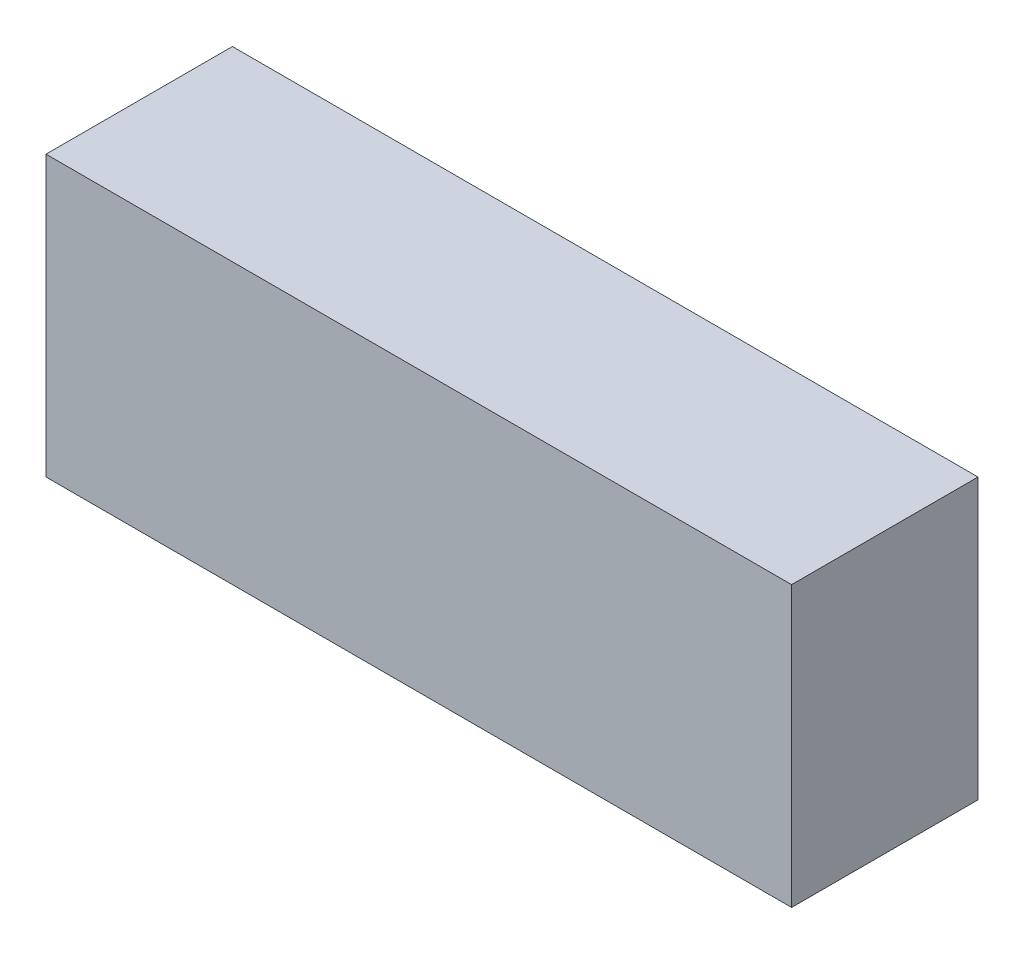
ISO-10303-21;
HEADER;
FILE_DESCRIPTION(('STEP AP214'),'2;1');
FILE_NAME('part.step','',(''),(''),'','','');
FILE_SCHEMA(('AUTOMOTIVE_DESIGN { 1 0 10303 214 1 1 1 1 }'));
ENDSEC;
DATA;
#1=APPLICATION_CONTEXT('core data for automotive mechanical design processes');
#2=APPLICATION_PROTOCOL_DEFINITION('international standard','automotive_design',2000,#1);
#3=PRODUCT_CONTEXT('',#1,'mechanical');
#4=PRODUCT('Part','Part','',(#3));
#5=PRODUCT_RELATED_PRODUCT_CATEGORY('part','',(#4));
#6=PRODUCT_DEFINITION_FORMATION('','',#4);
#7=PRODUCT_DEFINITION_CONTEXT('part definition',#1,'design');
#8=PRODUCT_DEFINITION('design','',#6,#7);
#9=PRODUCT_DEFINITION_SHAPE('','',#8);
#10=(LENGTH_UNIT() NAMED_UNIT(*) SI_UNIT(.MILLI.,.METRE.));
#11=(NAMED_UNIT(*) PLANE_ANGLE_UNIT() SI_UNIT($,.RADIAN.));
#12=(NAMED_UNIT(*) SI_UNIT($,.STERADIAN.) SOLID_ANGLE_UNIT());
#13=UNCERTAINTY_MEASURE_WITH_UNIT(LENGTH_MEASURE(1.E-05),#10,'distance_accuracy_value','');
#14=(GEOMETRIC_REPRESENTATION_CONTEXT(3) GLOBAL_UNCERTAINTY_ASSIGNED_CONTEXT((#13)) GLOBAL_UNIT_ASSIGNED_CONTEXT((#10,
#11,#12)) REPRESENTATION_CONTEXT('',''));
#15=CARTESIAN_POINT('',(0.,0.,0.));
#16=DIRECTION('',(0.,0.,1.));
#17=DIRECTION('',(1.,0.,0.));
#18=AXIS2_PLACEMENT_3D('',#15,#16,#17);
#19=CARTESIAN_POINT('',(40.,30.,10.));
#20=DIRECTION('',(-1.,0.,0.));
#21=DIRECTION('',(0.,0.,1.));
#22=AXIS2_PLACEMENT_3D('',#19,#20,#21);
#23=PLANE('',#22);
#24=DIRECTION('',(0.,0.,-1.));
#25=VECTOR('',#24,1.);
#26=CARTESIAN_POINT('',(40.,0.,10.));
#27=LINE('',#26,#25);
#28=CARTESIAN_POINT('',(40.,0.,10.));
#29=VERTEX_POINT('',#28);
#30=CARTESIAN_POINT('',(40.,0.,-10.));
#31=VERTEX_POINT('',#30);
#32=EDGE_CURVE('E105',#29,#31,#27,.T.);
#33=ORIENTED_EDGE('',*,*,#32,.T.);
#34=DIRECTION('',(0.,-1.,0.));
#35=VECTOR('',#34,1.);
#36=CARTESIAN_POINT('',(40.,30.,-10.));
#37=LINE('',#36,#35);
#38=CARTESIAN_POINT('',(40.,30.,-10.));
#39=VERTEX_POINT('',#38);
#40=EDGE_CURVE('E11',#39,#31,#37,.T.);
#41=ORIENTED_EDGE('',*,*,#40,.F.);
#42=DIRECTION('',(0.,0.,-1.));
#43=VECTOR('',#42,1.);
#44=CARTESIAN_POINT('',(40.,30.,10.));
#45=LINE('',#44,#43);
#46=CARTESIAN_POINT('',(40.,30.,10.));
#47=VERTEX_POINT('',#46);
#48=EDGE_CURVE('E89',#47,#39,#45,.T.);
#49=ORIENTED_EDGE('',*,*,#48,.F.);
#50=DIRECTION('',(0.,-1.,0.));
#51=VECTOR('',#50,1.);
#52=CARTESIAN_POINT('',(40.,30.,10.));
#53=LINE('',#52,#51);
#54=EDGE_CURVE('E98',#47,#29,#53,.T.);
#55=ORIENTED_EDGE('',*,*,#54,.T.);
#56=EDGE_LOOP('',(#33,#41,#49,#55));
#57=FACE_BOUND('',#56,.T.);
#58=ADVANCED_FACE('F39',(#57),#23,.F.);
#59=CARTESIAN_POINT('',(-40.,30.,-10.));
#60=DIRECTION('',(0.,0.,1.));
#61=DIRECTION('',(1.,0.,0.));
#62=AXIS2_PLACEMENT_3D('',#59,#60,#61);
#63=PLANE('',#62);
#64=DIRECTION('',(-1.,0.,0.));
#65=VECTOR('',#64,1.);
#66=CARTESIAN_POINT('',(-40.,0.,-10.));
#67=LINE('',#66,#65);
#68=CARTESIAN_POINT('',(-40.,0.,-10.));
#69=VERTEX_POINT('',#68);
#70=EDGE_CURVE('E94',#31,#69,#67,.T.);
#71=ORIENTED_EDGE('',*,*,#70,.T.);
#72=DIRECTION('',(0.,-1.,0.));
#73=VECTOR('',#72,1.);
#74=CARTESIAN_POINT('',(-40.,30.,-10.));
#75=LINE('',#74,#73);
#76=CARTESIAN_POINT('',(-40.,30.,-10.));
#77=VERTEX_POINT('',#76);
#78=EDGE_CURVE('E50',#77,#69,#75,.T.);
#79=ORIENTED_EDGE('',*,*,#78,.F.);
#80=DIRECTION('',(-1.,0.,0.));
#81=VECTOR('',#80,1.);
#82=CARTESIAN_POINT('',(-40.,30.,-10.));
#83=LINE('',#82,#81);
#84=EDGE_CURVE('E83',#39,#77,#83,.T.);
#85=ORIENTED_EDGE('',*,*,#84,.F.);
#86=ORIENTED_EDGE('',*,*,#40,.T.);
#87=EDGE_LOOP('',(#71,#79,#85,#86));
#88=FACE_BOUND('',#87,.T.);
#89=ADVANCED_FACE('F91',(#88),#63,.F.);
#90=CARTESIAN_POINT('',(-40.,30.,10.));
#91=DIRECTION('',(1.,0.,0.));
#92=DIRECTION('',(0.,0.,-1.));
#93=AXIS2_PLACEMENT_3D('',#90,#91,#92);
#94=PLANE('',#93);
#95=DIRECTION('',(0.,0.,1.));
#96=VECTOR('',#95,1.);
#97=CARTESIAN_POINT('',(-40.,0.,10.));
#98=LINE('',#97,#96);
#99=CARTESIAN_POINT('',(-40.,0.,10.));
#100=VERTEX_POINT('',#99);
#101=EDGE_CURVE('E75',#69,#100,#98,.T.);
#102=ORIENTED_EDGE('',*,*,#101,.T.);
#103=DIRECTION('',(0.,-1.,0.));
#104=VECTOR('',#103,1.);
#105=CARTESIAN_POINT('',(-40.,30.,10.));
#106=LINE('',#105,#104);
#107=CARTESIAN_POINT('',(-40.,30.,10.));
#108=VERTEX_POINT('',#107);
#109=EDGE_CURVE('E92',#108,#100,#106,.T.);
#110=ORIENTED_EDGE('',*,*,#109,.F.);
#111=DIRECTION('',(0.,0.,1.));
#112=VECTOR('',#111,1.);
#113=CARTESIAN_POINT('',(-40.,30.,10.));
#114=LINE('',#113,#112);
#115=EDGE_CURVE('E86',#77,#108,#114,.T.);
#116=ORIENTED_EDGE('',*,*,#115,.F.);
#117=ORIENTED_EDGE('',*,*,#78,.T.);
#118=EDGE_LOOP('',(#102,#110,#116,#117));
#119=FACE_BOUND('',#118,.T.);
#120=ADVANCED_FACE('F96',(#119),#94,.F.);
#121=CARTESIAN_POINT('',(-40.,30.,10.));
#122=DIRECTION('',(0.,0.,-1.));
#123=DIRECTION('',(-1.,0.,0.));
#124=AXIS2_PLACEMENT_3D('',#121,#122,#123);
#125=PLANE('',#124);
#126=DIRECTION('',(1.,0.,0.));
#127=VECTOR('',#126,1.);
#128=CARTESIAN_POINT('',(-40.,0.,10.));
#129=LINE('',#128,#127);
#130=EDGE_CURVE('E77',#100,#29,#129,.T.);
#131=ORIENTED_EDGE('',*,*,#130,.T.);
#132=ORIENTED_EDGE('',*,*,#54,.F.);
#133=DIRECTION('',(1.,0.,0.));
#134=VECTOR('',#133,1.);
#135=CARTESIAN_POINT('',(-40.,30.,10.));
#136=LINE('',#135,#134);
#137=EDGE_CURVE('E54',#108,#47,#136,.T.);
#138=ORIENTED_EDGE('',*,*,#137,.F.);
#139=ORIENTED_EDGE('',*,*,#109,.T.);
#140=EDGE_LOOP('',(#131,#132,#138,#139));
#141=FACE_BOUND('',#140,.T.);
#142=ADVANCED_FACE('F108',(#141),#125,.F.);
#143=CARTESIAN_POINT('',(0.,30.,0.));
#144=DIRECTION('',(0.,-1.,0.));
#145=DIRECTION('',(0.,0.,-1.));
#146=AXIS2_PLACEMENT_3D('',#143,#144,#145);
#147=PLANE('',#146);
#148=ORIENTED_EDGE('',*,*,#48,.T.);
#149=ORIENTED_EDGE('',*,*,#84,.T.);
#150=ORIENTED_EDGE('',*,*,#115,.T.);
#151=ORIENTED_EDGE('',*,*,#137,.T.);
#152=EDGE_LOOP('',(#148,#149,#150,#151));
#153=FACE_BOUND('',#152,.T.);
#154=ADVANCED_FACE('F88',(#153),#147,.F.);
#155=CARTESIAN_POINT('',(0.,0.,0.));
#156=DIRECTION('',(0.,-1.,0.));
#157=DIRECTION('',(0.,0.,-1.));
#158=AXIS2_PLACEMENT_3D('',#155,#156,#157);
#159=PLANE('',#158);
#160=ORIENTED_EDGE('',*,*,#32,.F.);
#161=ORIENTED_EDGE('',*,*,#130,.F.);
#162=ORIENTED_EDGE('',*,*,#101,.F.);
#163=ORIENTED_EDGE('',*,*,#70,.F.);
#164=EDGE_LOOP('',(#160,#161,#162,#163));
#165=FACE_BOUND('',#164,.T.);
#166=ADVANCED_FACE('F115',(#165),#159,.T.);
#167=CLOSED_SHELL('',(#58,#89,#120,#142,#154,#166));
#168=MANIFOLD_SOLID_BREP('B2',#167);
#169=ADVANCED_BREP_SHAPE_REPRESENTATION('',(#18,#168),#14);
#170=SHAPE_DEFINITION_REPRESENTATION(#9,#169);
ENDSEC;
END-ISO-10303-21;
